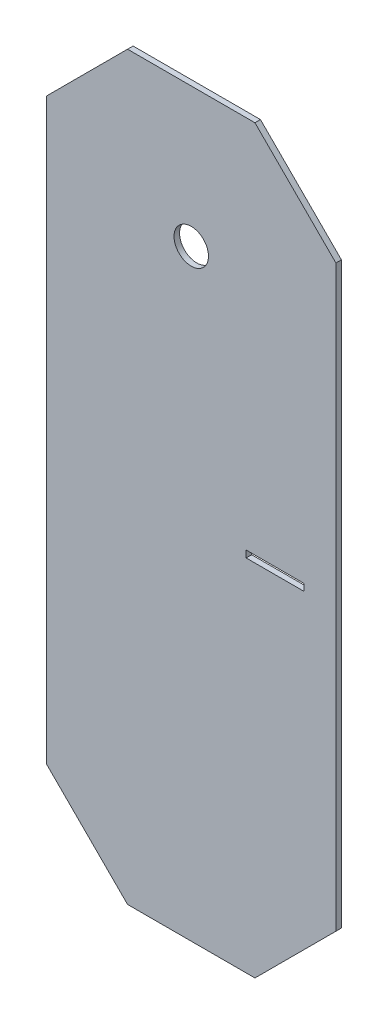
ISO-10303-21;
HEADER;
FILE_DESCRIPTION(('STEP AP214'),'2;1');
FILE_NAME('part.step','',(''),(''),'','','');
FILE_SCHEMA(('AUTOMOTIVE_DESIGN { 1 0 10303 214 1 1 1 1 }'));
ENDSEC;
DATA;
#1=APPLICATION_CONTEXT('core data for automotive mechanical design processes');
#2=APPLICATION_PROTOCOL_DEFINITION('international standard','automotive_design',2000,#1);
#3=PRODUCT_CONTEXT('',#1,'mechanical');
#4=PRODUCT('Part','Part','',(#3));
#5=PRODUCT_RELATED_PRODUCT_CATEGORY('part','',(#4));
#6=PRODUCT_DEFINITION_FORMATION('','',#4);
#7=PRODUCT_DEFINITION_CONTEXT('part definition',#1,'design');
#8=PRODUCT_DEFINITION('design','',#6,#7);
#9=PRODUCT_DEFINITION_SHAPE('','',#8);
#10=(LENGTH_UNIT() NAMED_UNIT(*) SI_UNIT(.MILLI.,.METRE.));
#11=(NAMED_UNIT(*) PLANE_ANGLE_UNIT() SI_UNIT($,.RADIAN.));
#12=(NAMED_UNIT(*) SI_UNIT($,.STERADIAN.) SOLID_ANGLE_UNIT());
#13=UNCERTAINTY_MEASURE_WITH_UNIT(LENGTH_MEASURE(1.E-05),#10,'distance_accuracy_value','');
#14=(GEOMETRIC_REPRESENTATION_CONTEXT(3) GLOBAL_UNCERTAINTY_ASSIGNED_CONTEXT((#13)) GLOBAL_UNIT_ASSIGNED_CONTEXT((#10,
#11,#12)) REPRESENTATION_CONTEXT('',''));
#15=CARTESIAN_POINT('',(0.,0.,0.));
#16=DIRECTION('',(0.,0.,1.));
#17=DIRECTION('',(1.,0.,0.));
#18=AXIS2_PLACEMENT_3D('',#15,#16,#17);
#19=CARTESIAN_POINT('',(-105.,640.774079522774,4.));
#20=DIRECTION('',(0.,0.,1.));
#21=DIRECTION('',(1.,0.,0.));
#22=AXIS2_PLACEMENT_3D('',#19,#20,#21);
#23=PLANE('',#22);
#24=DIRECTION('',(0.,1.,0.));
#25=VECTOR('',#24,1.);
#26=CARTESIAN_POINT('',(81.997805467701,369.036195336661,4.));
#27=LINE('',#26,#25);
#28=CARTESIAN_POINT('',(81.997805467701,364.036195336661,4.));
#29=VERTEX_POINT('',#28);
#30=CARTESIAN_POINT('',(81.9978054677011,369.036195336661,4.));
#31=VERTEX_POINT('',#30);
#32=EDGE_CURVE('E45',#29,#31,#27,.T.);
#33=ORIENTED_EDGE('',*,*,#32,.F.);
#34=DIRECTION('',(1.,0.,0.));
#35=VECTOR('',#34,1.);
#36=CARTESIAN_POINT('',(39.8282740876253,364.036195336661,4.));
#37=LINE('',#36,#35);
#38=CARTESIAN_POINT('',(39.8282740876253,364.036195336661,4.));
#39=VERTEX_POINT('',#38);
#40=EDGE_CURVE('E137',#39,#29,#37,.T.);
#41=ORIENTED_EDGE('',*,*,#40,.F.);
#42=DIRECTION('',(0.,-1.,0.));
#43=VECTOR('',#42,1.);
#44=CARTESIAN_POINT('',(39.8282740876253,369.036195336661,4.));
#45=LINE('',#44,#43);
#46=CARTESIAN_POINT('',(39.8282740876253,369.036195336661,4.));
#47=VERTEX_POINT('',#46);
#48=EDGE_CURVE('E140',#47,#39,#45,.T.);
#49=ORIENTED_EDGE('',*,*,#48,.F.);
#50=DIRECTION('',(-1.,0.,0.));
#51=VECTOR('',#50,1.);
#52=CARTESIAN_POINT('',(39.8282740876253,369.036195336661,4.));
#53=LINE('',#52,#51);
#54=EDGE_CURVE('E146',#31,#47,#53,.T.);
#55=ORIENTED_EDGE('',*,*,#54,.F.);
#56=EDGE_LOOP('',(#33,#41,#49,#55));
#57=FACE_BOUND('',#56,.T.);
#58=DIRECTION('',(0.,-1.,0.));
#59=VECTOR('',#58,1.);
#60=CARTESIAN_POINT('',(-105.,539.996445797992,4.));
#61=LINE('',#60,#59);
#62=CARTESIAN_POINT('',(-105.,581.996445797992,4.));
#63=VERTEX_POINT('',#62);
#64=CARTESIAN_POINT('',(-105.,161.993882509536,4.));
#65=VERTEX_POINT('',#64);
#66=EDGE_CURVE('E162',#63,#65,#61,.T.);
#67=ORIENTED_EDGE('',*,*,#66,.T.);
#68=DIRECTION('',(0.707106781186548,-0.707106781186547,0.));
#69=VECTOR('',#68,1.);
#70=CARTESIAN_POINT('',(-105.,161.993882509536,4.));
#71=LINE('',#70,#69);
#72=CARTESIAN_POINT('',(-46.2223662752187,103.216248784755,4.));
#73=VERTEX_POINT('',#72);
#74=EDGE_CURVE('E164',#65,#73,#71,.T.);
#75=ORIENTED_EDGE('',*,*,#74,.T.);
#76=DIRECTION('',(1.,0.,0.));
#77=VECTOR('',#76,1.);
#78=CARTESIAN_POINT('',(46.2223662752186,103.216248784755,4.));
#79=LINE('',#78,#77);
#80=CARTESIAN_POINT('',(46.2223662752186,103.216248784755,4.));
#81=VERTEX_POINT('',#80);
#82=EDGE_CURVE('E167',#73,#81,#79,.T.);
#83=ORIENTED_EDGE('',*,*,#82,.T.);
#84=DIRECTION('',(0.707106781186548,0.707106781186547,0.));
#85=VECTOR('',#84,1.);
#86=CARTESIAN_POINT('',(105.,161.993882509536,4.));
#87=LINE('',#86,#85);
#88=CARTESIAN_POINT('',(105.,161.993882509536,4.));
#89=VERTEX_POINT('',#88);
#90=EDGE_CURVE('E169',#81,#89,#87,.T.);
#91=ORIENTED_EDGE('',*,*,#90,.T.);
#92=DIRECTION('',(0.,1.,0.));
#93=VECTOR('',#92,1.);
#94=CARTESIAN_POINT('',(105.,203.993882509536,4.));
#95=LINE('',#94,#93);
#96=CARTESIAN_POINT('',(105.,581.996445797992,4.));
#97=VERTEX_POINT('',#96);
#98=EDGE_CURVE('E171',#89,#97,#95,.T.);
#99=ORIENTED_EDGE('',*,*,#98,.T.);
#100=DIRECTION('',(-0.707106781186548,0.707106781186547,0.));
#101=VECTOR('',#100,1.);
#102=CARTESIAN_POINT('',(105.,581.996445797992,4.));
#103=LINE('',#102,#101);
#104=CARTESIAN_POINT('',(46.2223662752186,640.774079522774,4.));
#105=VERTEX_POINT('',#104);
#106=EDGE_CURVE('E173',#97,#105,#103,.T.);
#107=ORIENTED_EDGE('',*,*,#106,.T.);
#108=DIRECTION('',(-1.,0.,0.));
#109=VECTOR('',#108,1.);
#110=CARTESIAN_POINT('',(46.2223662752186,640.774079522774,4.));
#111=LINE('',#110,#109);
#112=CARTESIAN_POINT('',(-46.2223662752187,640.774079522774,4.));
#113=VERTEX_POINT('',#112);
#114=EDGE_CURVE('E175',#105,#113,#111,.T.);
#115=ORIENTED_EDGE('',*,*,#114,.T.);
#116=DIRECTION('',(-0.707106781186548,-0.707106781186547,0.));
#117=VECTOR('',#116,1.);
#118=CARTESIAN_POINT('',(-105.,581.996445797992,4.));
#119=LINE('',#118,#117);
#120=EDGE_CURVE('E177',#113,#63,#119,.T.);
#121=ORIENTED_EDGE('',*,*,#120,.T.);
#122=EDGE_LOOP('',(#67,#75,#83,#91,#99,#107,#115,#121));
#123=FACE_BOUND('',#122,.T.);
#124=CARTESIAN_POINT('',(0.,539.996445797992,4.));
#125=DIRECTION('',(0.,0.,1.));
#126=DIRECTION('',(1.,0.,0.));
#127=AXIS2_PLACEMENT_3D('',#124,#125,#126);
#128=CIRCLE('',#127,12.5);
#129=CARTESIAN_POINT('',(12.5,539.996445797992,4.));
#130=VERTEX_POINT('',#129);
#131=EDGE_CURVE('E156',#130,#130,#128,.T.);
#132=ORIENTED_EDGE('',*,*,#131,.F.);
#133=EDGE_LOOP('',(#132));
#134=FACE_BOUND('',#133,.T.);
#135=ADVANCED_FACE('F30',(#57,#123,#134),#23,.T.);
#136=CARTESIAN_POINT('',(-105.,640.774079522774,0.));
#137=DIRECTION('',(0.,0.,1.));
#138=DIRECTION('',(1.,0.,0.));
#139=AXIS2_PLACEMENT_3D('',#136,#137,#138);
#140=PLANE('',#139);
#141=DIRECTION('',(1.,0.,0.));
#142=VECTOR('',#141,1.);
#143=CARTESIAN_POINT('',(39.8282740876253,364.036195336661,0.));
#144=LINE('',#143,#142);
#145=CARTESIAN_POINT('',(39.8282740876253,364.036195336661,0.));
#146=VERTEX_POINT('',#145);
#147=CARTESIAN_POINT('',(81.997805467701,364.036195336661,0.));
#148=VERTEX_POINT('',#147);
#149=EDGE_CURVE('E127',#146,#148,#144,.T.);
#150=ORIENTED_EDGE('',*,*,#149,.T.);
#151=DIRECTION('',(0.,1.,0.));
#152=VECTOR('',#151,1.);
#153=CARTESIAN_POINT('',(81.997805467701,369.036195336661,0.));
#154=LINE('',#153,#152);
#155=CARTESIAN_POINT('',(81.997805467701,369.036195336661,0.));
#156=VERTEX_POINT('',#155);
#157=EDGE_CURVE('E121',#148,#156,#154,.T.);
#158=ORIENTED_EDGE('',*,*,#157,.T.);
#159=DIRECTION('',(-1.,0.,0.));
#160=VECTOR('',#159,1.);
#161=CARTESIAN_POINT('',(39.8282740876253,369.036195336661,0.));
#162=LINE('',#161,#160);
#163=CARTESIAN_POINT('',(39.8282740876253,369.036195336661,0.));
#164=VERTEX_POINT('',#163);
#165=EDGE_CURVE('E130',#156,#164,#162,.T.);
#166=ORIENTED_EDGE('',*,*,#165,.T.);
#167=DIRECTION('',(0.,-1.,0.));
#168=VECTOR('',#167,1.);
#169=CARTESIAN_POINT('',(39.8282740876253,369.036195336661,0.));
#170=LINE('',#169,#168);
#171=EDGE_CURVE('E53',#164,#146,#170,.T.);
#172=ORIENTED_EDGE('',*,*,#171,.T.);
#173=EDGE_LOOP('',(#150,#158,#166,#172));
#174=FACE_BOUND('',#173,.T.);
#175=DIRECTION('',(0.,-1.,0.));
#176=VECTOR('',#175,1.);
#177=CARTESIAN_POINT('',(-105.,203.993882509536,0.));
#178=LINE('',#177,#176);
#179=CARTESIAN_POINT('',(-105.,581.996445797992,0.));
#180=VERTEX_POINT('',#179);
#181=CARTESIAN_POINT('',(-105.,161.993882509536,0.));
#182=VERTEX_POINT('',#181);
#183=EDGE_CURVE('E159',#180,#182,#178,.T.);
#184=ORIENTED_EDGE('',*,*,#183,.F.);
#185=DIRECTION('',(-0.707106781186548,-0.707106781186547,0.));
#186=VECTOR('',#185,1.);
#187=CARTESIAN_POINT('',(-105.,581.996445797992,0.));
#188=LINE('',#187,#186);
#189=CARTESIAN_POINT('',(-46.2223662752187,640.774079522774,0.));
#190=VERTEX_POINT('',#189);
#191=EDGE_CURVE('E165',#190,#180,#188,.T.);
#192=ORIENTED_EDGE('',*,*,#191,.F.);
#193=DIRECTION('',(-1.,0.,0.));
#194=VECTOR('',#193,1.);
#195=CARTESIAN_POINT('',(46.2223662752186,640.774079522774,0.));
#196=LINE('',#195,#194);
#197=CARTESIAN_POINT('',(46.2223662752186,640.774079522774,0.));
#198=VERTEX_POINT('',#197);
#199=EDGE_CURVE('E192',#198,#190,#196,.T.);
#200=ORIENTED_EDGE('',*,*,#199,.F.);
#201=DIRECTION('',(-0.707106781186548,0.707106781186547,0.));
#202=VECTOR('',#201,1.);
#203=CARTESIAN_POINT('',(105.,581.996445797992,0.));
#204=LINE('',#203,#202);
#205=CARTESIAN_POINT('',(105.,581.996445797992,0.));
#206=VERTEX_POINT('',#205);
#207=EDGE_CURVE('E190',#206,#198,#204,.T.);
#208=ORIENTED_EDGE('',*,*,#207,.F.);
#209=DIRECTION('',(0.,1.,0.));
#210=VECTOR('',#209,1.);
#211=CARTESIAN_POINT('',(105.,539.996445797992,0.));
#212=LINE('',#211,#210);
#213=CARTESIAN_POINT('',(105.,161.993882509536,0.));
#214=VERTEX_POINT('',#213);
#215=EDGE_CURVE('E188',#214,#206,#212,.T.);
#216=ORIENTED_EDGE('',*,*,#215,.F.);
#217=DIRECTION('',(0.707106781186548,0.707106781186547,0.));
#218=VECTOR('',#217,1.);
#219=CARTESIAN_POINT('',(105.,161.993882509536,0.));
#220=LINE('',#219,#218);
#221=CARTESIAN_POINT('',(46.2223662752186,103.216248784755,0.));
#222=VERTEX_POINT('',#221);
#223=EDGE_CURVE('E185',#222,#214,#220,.T.);
#224=ORIENTED_EDGE('',*,*,#223,.F.);
#225=DIRECTION('',(1.,0.,0.));
#226=VECTOR('',#225,1.);
#227=CARTESIAN_POINT('',(46.2223662752186,103.216248784755,0.));
#228=LINE('',#227,#226);
#229=CARTESIAN_POINT('',(-46.2223662752187,103.216248784755,0.));
#230=VERTEX_POINT('',#229);
#231=EDGE_CURVE('E183',#230,#222,#228,.T.);
#232=ORIENTED_EDGE('',*,*,#231,.F.);
#233=DIRECTION('',(0.707106781186548,-0.707106781186547,0.));
#234=VECTOR('',#233,1.);
#235=CARTESIAN_POINT('',(-105.,161.993882509536,0.));
#236=LINE('',#235,#234);
#237=EDGE_CURVE('E181',#182,#230,#236,.T.);
#238=ORIENTED_EDGE('',*,*,#237,.F.);
#239=EDGE_LOOP('',(#184,#192,#200,#208,#216,#224,#232,#238));
#240=FACE_BOUND('',#239,.T.);
#241=CARTESIAN_POINT('',(0.,539.996445797992,0.));
#242=DIRECTION('',(0.,0.,1.));
#243=DIRECTION('',(1.,0.,0.));
#244=AXIS2_PLACEMENT_3D('',#241,#242,#243);
#245=CIRCLE('',#244,12.5);
#246=CARTESIAN_POINT('',(12.5,539.996445797992,0.));
#247=VERTEX_POINT('',#246);
#248=EDGE_CURVE('E152',#247,#247,#245,.T.);
#249=ORIENTED_EDGE('',*,*,#248,.T.);
#250=EDGE_LOOP('',(#249));
#251=FACE_BOUND('',#250,.T.);
#252=ADVANCED_FACE('F134',(#174,#240,#251),#140,.F.);
#253=CARTESIAN_POINT('',(-105.,203.993882509536,4.));
#254=DIRECTION('',(1.,0.,0.));
#255=DIRECTION('',(0.,1.,0.));
#256=AXIS2_PLACEMENT_3D('',#253,#254,#255);
#257=PLANE('',#256);
#258=ORIENTED_EDGE('',*,*,#183,.T.);
#259=DIRECTION('',(0.,0.,-1.));
#260=VECTOR('',#259,1.);
#261=CARTESIAN_POINT('',(-105.,161.993882509536,4.));
#262=LINE('',#261,#260);
#263=EDGE_CURVE('E11',#65,#182,#262,.T.);
#264=ORIENTED_EDGE('',*,*,#263,.F.);
#265=ORIENTED_EDGE('',*,*,#66,.F.);
#266=DIRECTION('',(0.,0.,-1.));
#267=VECTOR('',#266,1.);
#268=CARTESIAN_POINT('',(-105.,581.996445797992,4.));
#269=LINE('',#268,#267);
#270=EDGE_CURVE('E179',#63,#180,#269,.T.);
#271=ORIENTED_EDGE('',*,*,#270,.T.);
#272=EDGE_LOOP('',(#258,#264,#265,#271));
#273=FACE_BOUND('',#272,.T.);
#274=ADVANCED_FACE('F32',(#273),#257,.F.);
#275=CARTESIAN_POINT('',(-105.,161.993882509536,4.));
#276=DIRECTION('',(0.707106781186547,0.707106781186548,0.));
#277=DIRECTION('',(-0.707106781186548,0.707106781186547,0.));
#278=AXIS2_PLACEMENT_3D('',#275,#276,#277);
#279=PLANE('',#278);
#280=ORIENTED_EDGE('',*,*,#237,.T.);
#281=DIRECTION('',(0.,0.,-1.));
#282=VECTOR('',#281,1.);
#283=CARTESIAN_POINT('',(-46.2223662752187,103.216248784755,4.));
#284=LINE('',#283,#282);
#285=EDGE_CURVE('E38',#73,#230,#284,.T.);
#286=ORIENTED_EDGE('',*,*,#285,.F.);
#287=ORIENTED_EDGE('',*,*,#74,.F.);
#288=ORIENTED_EDGE('',*,*,#263,.T.);
#289=EDGE_LOOP('',(#280,#286,#287,#288));
#290=FACE_BOUND('',#289,.T.);
#291=ADVANCED_FACE('F239',(#290),#279,.F.);
#292=CARTESIAN_POINT('',(46.2223662752186,103.216248784755,4.));
#293=DIRECTION('',(0.,1.,0.));
#294=DIRECTION('',(0.,0.,1.));
#295=AXIS2_PLACEMENT_3D('',#292,#293,#294);
#296=PLANE('',#295);
#297=ORIENTED_EDGE('',*,*,#231,.T.);
#298=DIRECTION('',(0.,0.,-1.));
#299=VECTOR('',#298,1.);
#300=CARTESIAN_POINT('',(46.2223662752186,103.216248784755,4.));
#301=LINE('',#300,#299);
#302=EDGE_CURVE('E210',#81,#222,#301,.T.);
#303=ORIENTED_EDGE('',*,*,#302,.F.);
#304=ORIENTED_EDGE('',*,*,#82,.F.);
#305=ORIENTED_EDGE('',*,*,#285,.T.);
#306=EDGE_LOOP('',(#297,#303,#304,#305));
#307=FACE_BOUND('',#306,.T.);
#308=ADVANCED_FACE('F217',(#307),#296,.F.);
#309=CARTESIAN_POINT('',(105.,161.993882509536,4.));
#310=DIRECTION('',(-0.707106781186547,0.707106781186548,0.));
#311=DIRECTION('',(-0.707106781186548,-0.707106781186547,0.));
#312=AXIS2_PLACEMENT_3D('',#309,#310,#311);
#313=PLANE('',#312);
#314=ORIENTED_EDGE('',*,*,#223,.T.);
#315=DIRECTION('',(0.,0.,-1.));
#316=VECTOR('',#315,1.);
#317=CARTESIAN_POINT('',(105.,161.993882509536,4.));
#318=LINE('',#317,#316);
#319=EDGE_CURVE('E207',#89,#214,#318,.T.);
#320=ORIENTED_EDGE('',*,*,#319,.F.);
#321=ORIENTED_EDGE('',*,*,#90,.F.);
#322=ORIENTED_EDGE('',*,*,#302,.T.);
#323=EDGE_LOOP('',(#314,#320,#321,#322));
#324=FACE_BOUND('',#323,.T.);
#325=ADVANCED_FACE('F227',(#324),#313,.F.);
#326=CARTESIAN_POINT('',(105.,539.996445797992,4.));
#327=DIRECTION('',(-1.,0.,0.));
#328=DIRECTION('',(0.,-1.,0.));
#329=AXIS2_PLACEMENT_3D('',#326,#327,#328);
#330=PLANE('',#329);
#331=ORIENTED_EDGE('',*,*,#215,.T.);
#332=DIRECTION('',(0.,0.,-1.));
#333=VECTOR('',#332,1.);
#334=CARTESIAN_POINT('',(105.,581.996445797992,4.));
#335=LINE('',#334,#333);
#336=EDGE_CURVE('E204',#97,#206,#335,.T.);
#337=ORIENTED_EDGE('',*,*,#336,.F.);
#338=ORIENTED_EDGE('',*,*,#98,.F.);
#339=ORIENTED_EDGE('',*,*,#319,.T.);
#340=EDGE_LOOP('',(#331,#337,#338,#339));
#341=FACE_BOUND('',#340,.T.);
#342=ADVANCED_FACE('F231',(#341),#330,.F.);
#343=CARTESIAN_POINT('',(105.,581.996445797992,4.));
#344=DIRECTION('',(-0.707106781186547,-0.707106781186548,0.));
#345=DIRECTION('',(0.707106781186548,-0.707106781186547,0.));
#346=AXIS2_PLACEMENT_3D('',#343,#344,#345);
#347=PLANE('',#346);
#348=ORIENTED_EDGE('',*,*,#207,.T.);
#349=DIRECTION('',(0.,0.,-1.));
#350=VECTOR('',#349,1.);
#351=CARTESIAN_POINT('',(46.2223662752186,640.774079522774,4.));
#352=LINE('',#351,#350);
#353=EDGE_CURVE('E201',#105,#198,#352,.T.);
#354=ORIENTED_EDGE('',*,*,#353,.F.);
#355=ORIENTED_EDGE('',*,*,#106,.F.);
#356=ORIENTED_EDGE('',*,*,#336,.T.);
#357=EDGE_LOOP('',(#348,#354,#355,#356));
#358=FACE_BOUND('',#357,.T.);
#359=ADVANCED_FACE('F252',(#358),#347,.F.);
#360=CARTESIAN_POINT('',(46.2223662752186,640.774079522774,4.));
#361=DIRECTION('',(0.,-1.,0.));
#362=DIRECTION('',(0.,0.,-1.));
#363=AXIS2_PLACEMENT_3D('',#360,#361,#362);
#364=PLANE('',#363);
#365=ORIENTED_EDGE('',*,*,#199,.T.);
#366=DIRECTION('',(0.,0.,-1.));
#367=VECTOR('',#366,1.);
#368=CARTESIAN_POINT('',(-46.2223662752187,640.774079522774,4.));
#369=LINE('',#368,#367);
#370=EDGE_CURVE('E198',#113,#190,#369,.T.);
#371=ORIENTED_EDGE('',*,*,#370,.F.);
#372=ORIENTED_EDGE('',*,*,#114,.F.);
#373=ORIENTED_EDGE('',*,*,#353,.T.);
#374=EDGE_LOOP('',(#365,#371,#372,#373));
#375=FACE_BOUND('',#374,.T.);
#376=ADVANCED_FACE('F250',(#375),#364,.F.);
#377=CARTESIAN_POINT('',(-105.,581.996445797992,4.));
#378=DIRECTION('',(0.707106781186547,-0.707106781186548,0.));
#379=DIRECTION('',(0.707106781186548,0.707106781186547,0.));
#380=AXIS2_PLACEMENT_3D('',#377,#378,#379);
#381=PLANE('',#380);
#382=ORIENTED_EDGE('',*,*,#191,.T.);
#383=ORIENTED_EDGE('',*,*,#270,.F.);
#384=ORIENTED_EDGE('',*,*,#120,.F.);
#385=ORIENTED_EDGE('',*,*,#370,.T.);
#386=EDGE_LOOP('',(#382,#383,#384,#385));
#387=FACE_BOUND('',#386,.T.);
#388=ADVANCED_FACE('F245',(#387),#381,.F.);
#389=CARTESIAN_POINT('',(0.,539.996445797992,4.));
#390=DIRECTION('',(0.,0.,-1.));
#391=DIRECTION('',(-1.,0.,0.));
#392=AXIS2_PLACEMENT_3D('',#389,#390,#391);
#393=CYLINDRICAL_SURFACE('',#392,12.5);
#394=ORIENTED_EDGE('',*,*,#131,.T.);
#395=EDGE_LOOP('',(#394));
#396=FACE_BOUND('',#395,.T.);
#397=ORIENTED_EDGE('',*,*,#248,.F.);
#398=EDGE_LOOP('',(#397));
#399=FACE_BOUND('',#398,.T.);
#400=ADVANCED_FACE('F270',(#396,#399),#393,.F.);
#401=CARTESIAN_POINT('',(81.997805467701,369.036195336661,0.));
#402=DIRECTION('',(1.,0.,0.));
#403=DIRECTION('',(0.,0.,-1.));
#404=AXIS2_PLACEMENT_3D('',#401,#402,#403);
#405=PLANE('',#404);
#406=ORIENTED_EDGE('',*,*,#32,.T.);
#407=DIRECTION('',(0.,0.,1.));
#408=VECTOR('',#407,1.);
#409=CARTESIAN_POINT('',(81.997805467701,369.036195336661,0.));
#410=LINE('',#409,#408);
#411=EDGE_CURVE('E117',#156,#31,#410,.T.);
#412=ORIENTED_EDGE('',*,*,#411,.F.);
#413=ORIENTED_EDGE('',*,*,#157,.F.);
#414=DIRECTION('',(0.,0.,1.));
#415=VECTOR('',#414,1.);
#416=CARTESIAN_POINT('',(81.997805467701,364.036195336661,0.));
#417=LINE('',#416,#415);
#418=EDGE_CURVE('E150',#148,#29,#417,.T.);
#419=ORIENTED_EDGE('',*,*,#418,.T.);
#420=EDGE_LOOP('',(#406,#412,#413,#419));
#421=FACE_BOUND('',#420,.T.);
#422=ADVANCED_FACE('F119',(#421),#405,.F.);
#423=CARTESIAN_POINT('',(39.8282740876253,364.036195336661,0.));
#424=DIRECTION('',(0.,-1.,0.));
#425=DIRECTION('',(0.,0.,-1.));
#426=AXIS2_PLACEMENT_3D('',#423,#424,#425);
#427=PLANE('',#426);
#428=ORIENTED_EDGE('',*,*,#40,.T.);
#429=ORIENTED_EDGE('',*,*,#418,.F.);
#430=ORIENTED_EDGE('',*,*,#149,.F.);
#431=DIRECTION('',(0.,0.,1.));
#432=VECTOR('',#431,1.);
#433=CARTESIAN_POINT('',(39.8282740876253,364.036195336661,0.));
#434=LINE('',#433,#432);
#435=EDGE_CURVE('E153',#146,#39,#434,.T.);
#436=ORIENTED_EDGE('',*,*,#435,.T.);
#437=EDGE_LOOP('',(#428,#429,#430,#436));
#438=FACE_BOUND('',#437,.T.);
#439=ADVANCED_FACE('F280',(#438),#427,.F.);
#440=CARTESIAN_POINT('',(39.8282740876253,369.036195336661,0.));
#441=DIRECTION('',(-1.,0.,0.));
#442=DIRECTION('',(0.,0.,1.));
#443=AXIS2_PLACEMENT_3D('',#440,#441,#442);
#444=PLANE('',#443);
#445=ORIENTED_EDGE('',*,*,#48,.T.);
#446=ORIENTED_EDGE('',*,*,#435,.F.);
#447=ORIENTED_EDGE('',*,*,#171,.F.);
#448=DIRECTION('',(0.,0.,1.));
#449=VECTOR('',#448,1.);
#450=CARTESIAN_POINT('',(39.8282740876253,369.036195336661,0.));
#451=LINE('',#450,#449);
#452=EDGE_CURVE('E126',#164,#47,#451,.T.);
#453=ORIENTED_EDGE('',*,*,#452,.T.);
#454=EDGE_LOOP('',(#445,#446,#447,#453));
#455=FACE_BOUND('',#454,.T.);
#456=ADVANCED_FACE('F287',(#455),#444,.F.);
#457=CARTESIAN_POINT('',(39.8282740876253,369.036195336661,0.));
#458=DIRECTION('',(0.,1.,0.));
#459=DIRECTION('',(0.,0.,1.));
#460=AXIS2_PLACEMENT_3D('',#457,#458,#459);
#461=PLANE('',#460);
#462=ORIENTED_EDGE('',*,*,#54,.T.);
#463=ORIENTED_EDGE('',*,*,#452,.F.);
#464=ORIENTED_EDGE('',*,*,#165,.F.);
#465=ORIENTED_EDGE('',*,*,#411,.T.);
#466=EDGE_LOOP('',(#462,#463,#464,#465));
#467=FACE_BOUND('',#466,.T.);
#468=ADVANCED_FACE('F131',(#467),#461,.F.);
#469=CLOSED_SHELL('',(#135,#252,#274,#291,#308,#325,#342,#359,#376,#388,#400,#422,#439,#456,#468));
#470=MANIFOLD_SOLID_BREP('B2',#469);
#471=ADVANCED_BREP_SHAPE_REPRESENTATION('',(#18,#470),#14);
#472=SHAPE_DEFINITION_REPRESENTATION(#9,#471);
ENDSEC;
END-ISO-10303-21;
